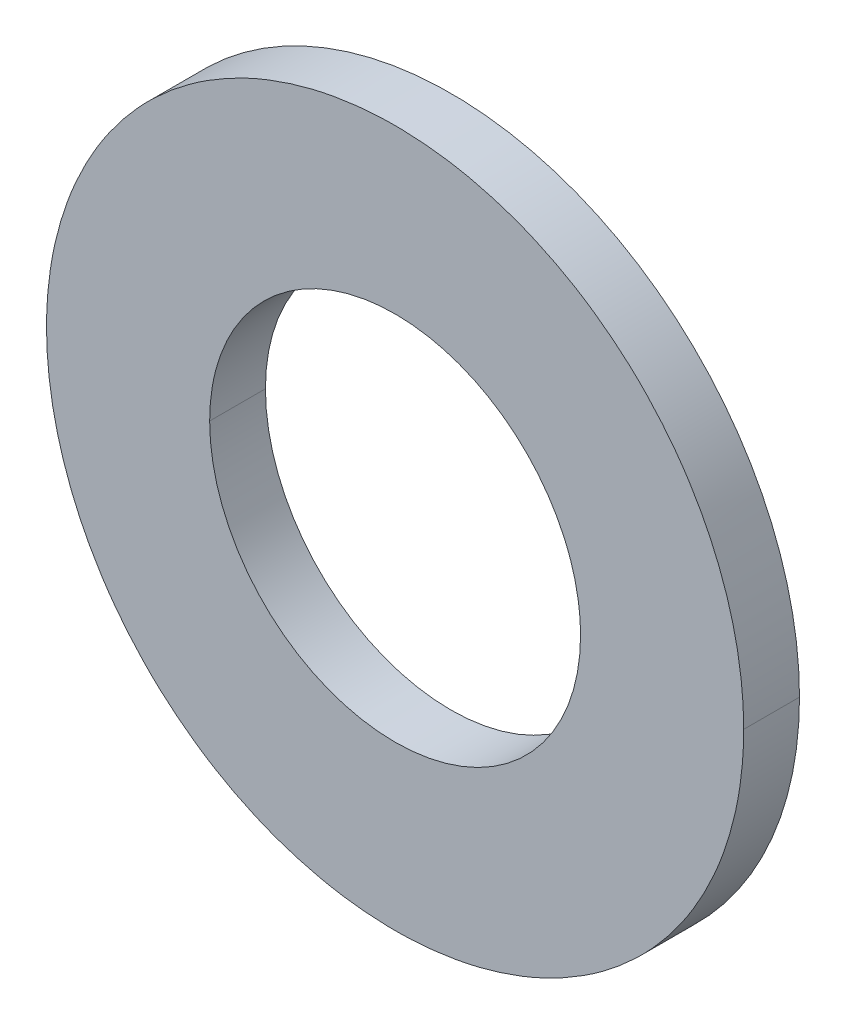
ISO-10303-21;
HEADER;
FILE_DESCRIPTION(('STEP AP214'),'2;1');
FILE_NAME('part.step','',(''),(''),'','','');
FILE_SCHEMA(('AUTOMOTIVE_DESIGN { 1 0 10303 214 1 1 1 1 }'));
ENDSEC;
DATA;
#1=APPLICATION_CONTEXT('core data for automotive mechanical design processes');
#2=APPLICATION_PROTOCOL_DEFINITION('international standard','automotive_design',2000,#1);
#3=PRODUCT_CONTEXT('',#1,'mechanical');
#4=PRODUCT('Part','Part','',(#3));
#5=PRODUCT_RELATED_PRODUCT_CATEGORY('part','',(#4));
#6=PRODUCT_DEFINITION_FORMATION('','',#4);
#7=PRODUCT_DEFINITION_CONTEXT('part definition',#1,'design');
#8=PRODUCT_DEFINITION('design','',#6,#7);
#9=PRODUCT_DEFINITION_SHAPE('','',#8);
#10=(LENGTH_UNIT() NAMED_UNIT(*) SI_UNIT(.MILLI.,.METRE.));
#11=(NAMED_UNIT(*) PLANE_ANGLE_UNIT() SI_UNIT($,.RADIAN.));
#12=(NAMED_UNIT(*) SI_UNIT($,.STERADIAN.) SOLID_ANGLE_UNIT());
#13=UNCERTAINTY_MEASURE_WITH_UNIT(LENGTH_MEASURE(1.E-05),#10,'distance_accuracy_value','');
#14=(GEOMETRIC_REPRESENTATION_CONTEXT(3) GLOBAL_UNCERTAINTY_ASSIGNED_CONTEXT((#13)) GLOBAL_UNIT_ASSIGNED_CONTEXT((#10,
#11,#12)) REPRESENTATION_CONTEXT('',''));
#15=CARTESIAN_POINT('',(0.,0.,0.));
#16=DIRECTION('',(0.,0.,1.));
#17=DIRECTION('',(1.,0.,0.));
#18=AXIS2_PLACEMENT_3D('',#15,#16,#17);
#19=CARTESIAN_POINT('',(6.35,0.,-1.016));
#20=CARTESIAN_POINT('',(6.35,0.,0.));
#21=(BOUNDED_CURVE() B_SPLINE_CURVE(1,(#19,#20),.UNSPECIFIED.,.F.,
.F.) B_SPLINE_CURVE_WITH_KNOTS((2,2),(0.,1.),
.UNSPECIFIED.) CURVE() GEOMETRIC_REPRESENTATION_ITEM() RATIONAL_B_SPLINE_CURVE((1.,1.)) REPRESENTATION_ITEM(''));
#22=CARTESIAN_POINT('',(0.,0.,-1.016));
#23=DIRECTION('',(0.,0.,1.));
#24=AXIS1_PLACEMENT('',#22,#23);
#25=SURFACE_OF_REVOLUTION('',#21,#24);
#26=CARTESIAN_POINT('',(-6.35,-2.60481354214471E-09,-1.016));
#27=CARTESIAN_POINT('',(-6.35,-2.60481354214471E-09,-0.973666666666667));
#28=CARTESIAN_POINT('',(-6.35,-2.60481354214471E-09,-0.931333333333333));
#29=CARTESIAN_POINT('',(-6.35,-2.60481354214471E-09,-0.846666666666667));
#30=CARTESIAN_POINT('',(-6.35,-2.60481354214471E-09,-0.804333333333333));
#31=CARTESIAN_POINT('',(-6.35,-2.60481354214471E-09,-0.719666666666667));
#32=CARTESIAN_POINT('',(-6.35,-2.60481354214471E-09,-0.677333333333333));
#33=CARTESIAN_POINT('',(-6.35,-2.60481354214471E-09,-0.592666666666667));
#34=CARTESIAN_POINT('',(-6.35,-2.60481354214471E-09,-0.550333333333333));
#35=CARTESIAN_POINT('',(-6.35,-2.60481354214471E-09,-0.465666666666667));
#36=CARTESIAN_POINT('',(-6.35,-2.60481354214471E-09,-0.423333333333333));
#37=CARTESIAN_POINT('',(-6.35,-2.60481354214471E-09,-0.338666666666667));
#38=CARTESIAN_POINT('',(-6.35,-2.60481354214471E-09,-0.296333333333333));
#39=CARTESIAN_POINT('',(-6.35,-2.60481354214471E-09,-0.211666666666667));
#40=CARTESIAN_POINT('',(-6.35,-2.60481354214471E-09,-0.169333333333333));
#41=CARTESIAN_POINT('',(-6.35,-2.60481354214471E-09,-0.0846666666666666));
#42=CARTESIAN_POINT('',(-6.35,-2.60481354214471E-09,-0.0423333333333333));
#43=CARTESIAN_POINT('',(-6.35,-2.60481354214471E-09,0.));
#44=B_SPLINE_CURVE_WITH_KNOTS('',3,(#26,#27,#28,#29,#30,#31,#32,#33,#34,#35,#36,#37,#38,#39,#40,
#41,#42,#43),.UNSPECIFIED.,.F.,.F.,(4,2,2,2,2,2,2,2,4),(0.,0.127,0.254,0.381,0.508,0.635,0.762,
0.889,1.016),.UNSPECIFIED.);
#45=CARTESIAN_POINT('',(-6.34999999895013,-1.7365423614298E-09,-1.016));
#46=VERTEX_POINT('',#45);
#47=CARTESIAN_POINT('',(-6.34999999895013,-1.7365423614298E-09,0.));
#48=VERTEX_POINT('',#47);
#49=EDGE_CURVE('E74',#46,#48,#44,.T.);
#50=ORIENTED_EDGE('',*,*,#49,.T.);
#51=CARTESIAN_POINT('',(6.3499999968504,0.,0.));
#52=CARTESIAN_POINT('',(6.3500088071393,0.10402718293358,0.));
#53=CARTESIAN_POINT('',(6.34746861410088,0.208055834112407,0.));
#54=CARTESIAN_POINT('',(6.33729199938339,0.415611505818262,0.));
#55=CARTESIAN_POINT('',(6.32966789939476,0.519139131064897,0.));
#56=CARTESIAN_POINT('',(6.30932536308378,0.725693057743752,0.));
#57=CARTESIAN_POINT('',(6.29660692678814,0.8287193591786,0.));
#58=CARTESIAN_POINT('',(6.2660910307563,1.03427093334799,0.));
#59=CARTESIAN_POINT('',(6.24828135058346,1.13679438949575,0.));
#60=CARTESIAN_POINT('',(6.2076917179511,1.34085269992039,0.));
#61=CARTESIAN_POINT('',(6.18491176547595,1.44238755419415,0.));
#62=CARTESIAN_POINT('',(6.13444327093591,1.64397021747285,0.));
#63=CARTESIAN_POINT('',(6.10676671542323,1.74402102540889,0.));
#64=CARTESIAN_POINT('',(6.04651712870232,1.94263731641986,0.));
#65=CARTESIAN_POINT('',(6.01394409748051,2.04120279949067,0.));
#66=CARTESIAN_POINT('',(5.94391376914439,2.23685143757296,0.));
#67=CARTESIAN_POINT('',(5.9064448393609,2.33393042665802,0.));
#68=CARTESIAN_POINT('',(5.82682523300257,2.5261491630898,0.));
#69=CARTESIAN_POINT('',(5.78467455639334,2.62128891042227,0.));
#70=CARTESIAN_POINT('',(5.69584899617699,2.8091523093258,0.));
#71=CARTESIAN_POINT('',(5.64918528387286,2.90188124068928,0.));
#72=CARTESIAN_POINT('',(5.55134525169993,3.08492706417087,0.));
#73=CARTESIAN_POINT('',(5.50016893184294,3.17524395629528,0.));
#74=CARTESIAN_POINT('',(5.39331505899756,3.35347101977729,0.));
#75=CARTESIAN_POINT('',(5.33762690959841,3.44137483584233,0.));
#76=CARTESIAN_POINT('',(5.22203715653275,3.61436712646551,0.));
#77=CARTESIAN_POINT('',(5.16213555291289,3.69945560105484,0.));
#78=CARTESIAN_POINT('',(5.03836642484516,3.86638024965866,0.));
#79=CARTESIAN_POINT('',(4.97450882698995,3.94822378141291,0.));
#80=CARTESIAN_POINT('',(4.8428382975015,4.10866478685413,0.));
#81=CARTESIAN_POINT('',(4.77502536585405,4.18726226052944,0.));
#82=CARTESIAN_POINT('',(4.63545428721804,4.34121858553975,0.));
#83=CARTESIAN_POINT('',(4.56368698725877,4.41656913641962,0.));
#84=CARTESIAN_POINT('',(4.41656913641962,4.56368698725878,0.));
#85=CARTESIAN_POINT('',(4.34121858553975,4.63545428721807,0.));
#86=CARTESIAN_POINT('',(4.18726226052943,4.77502536585404,0.));
#87=CARTESIAN_POINT('',(4.10866478685413,4.84283829750142,0.));
#88=CARTESIAN_POINT('',(3.94822378141289,4.97450882699004,0.));
#89=CARTESIAN_POINT('',(3.86638024965861,5.03836642484548,0.));
#90=CARTESIAN_POINT('',(3.69945560105486,5.16213555291257,0.));
#91=CARTESIAN_POINT('',(3.61436712646562,5.22203715653154,0.));
#92=CARTESIAN_POINT('',(3.44137483584221,5.33762690959962,0.));
#93=CARTESIAN_POINT('',(3.35347101977685,5.39331505900206,0.));
#94=CARTESIAN_POINT('',(3.1752439562957,5.50016893183845,0.));
#95=CARTESIAN_POINT('',(3.08492706417247,5.55134525168318,0.));
#96=CARTESIAN_POINT('',(2.90188124068766,5.64918528388961,0.));
#97=CARTESIAN_POINT('',(2.80915230931978,5.6958489962395,0.));
#98=CARTESIAN_POINT('',(2.62128891042829,5.78467455633069,0.));
#99=CARTESIAN_POINT('',(2.52614916311232,5.82682523276847,0.));
#100=CARTESIAN_POINT('',(2.3339304266355,5.906444839595,0.));
#101=CARTESIAN_POINT('',(2.2368514374889,5.94391377001815,0.));
#102=CARTESIAN_POINT('',(2.04120279957451,6.01394409660886,0.));
#103=CARTESIAN_POINT('',(1.94263731673244,6.04651712545292,0.));
#104=CARTESIAN_POINT('',(1.74402102509629,6.10676671867264,0.));
#105=CARTESIAN_POINT('',(1.64397021630633,6.13444328306189,0.));
#106=CARTESIAN_POINT('',(1.44238755536348,6.18491175332063,0.));
#107=CARTESIAN_POINT('',(1.34085270428929,6.2076916725361,0.));
#108=CARTESIAN_POINT('',(1.13679438512685,6.24828139599846,0.));
#109=CARTESIAN_POINT('',(1.03427091704172,6.26609120026098,0.));
#110=CARTESIAN_POINT('',(0.828719375445476,6.2966067576928,0.));
#111=CARTESIAN_POINT('',(0.725693118384898,6.30932473271503,0.));
#112=CARTESIAN_POINT('',(0.519139070423723,6.32966852976351,0.));
#113=CARTESIAN_POINT('',(0.415611279520495,6.33729435176305,0.));
#114=CARTESIAN_POINT('',(0.208056060957957,6.34746625602671,0.));
#115=CARTESIAN_POINT('',(0.104028030478978,6.3499999968504,0.));
#116=CARTESIAN_POINT('',(-0.104028030478988,6.3499999968504,0.));
#117=CARTESIAN_POINT('',(-0.208056060957976,6.34746625602671,0.));
#118=CARTESIAN_POINT('',(-0.415611279520522,6.33729435176305,0.));
#119=CARTESIAN_POINT('',(-0.519139070423747,6.32966852976351,0.));
#120=CARTESIAN_POINT('',(-0.725693118384917,6.30932473271503,0.));
#121=CARTESIAN_POINT('',(-0.828719375445492,6.2966067576928,0.));
#122=CARTESIAN_POINT('',(-1.03427091704173,6.26609120026098,0.));
#123=CARTESIAN_POINT('',(-1.13679438512685,6.24828139599846,0.));
#124=CARTESIAN_POINT('',(-1.34085270428929,6.2076916725361,0.));
#125=CARTESIAN_POINT('',(-1.44238755536349,6.18491175332062,0.));
#126=CARTESIAN_POINT('',(-1.64397021630634,6.13444328306188,0.));
#127=CARTESIAN_POINT('',(-1.7440210250963,6.10676671867263,0.));
#128=CARTESIAN_POINT('',(-1.94263731673246,6.04651712545292,0.));
#129=CARTESIAN_POINT('',(-2.04120279957452,6.01394409660886,0.));
#130=CARTESIAN_POINT('',(-2.23685143748891,5.94391377001815,0.));
#131=CARTESIAN_POINT('',(-2.3339304266355,5.906444839595,0.));
#132=CARTESIAN_POINT('',(-2.52614916311233,5.82682523276847,0.));
#133=CARTESIAN_POINT('',(-2.6212889104283,5.78467455633068,0.));
#134=CARTESIAN_POINT('',(-2.80915230931979,5.69584899623949,0.));
#135=CARTESIAN_POINT('',(-2.90188124068767,5.64918528388961,0.));
#136=CARTESIAN_POINT('',(-3.08492706417248,5.55134525168318,0.));
#137=CARTESIAN_POINT('',(-3.17524395629571,5.50016893183845,0.));
#138=CARTESIAN_POINT('',(-3.35347101977686,5.39331505900206,0.));
#139=CARTESIAN_POINT('',(-3.44137483584221,5.33762690959962,0.));
#140=CARTESIAN_POINT('',(-3.61436712646562,5.22203715653154,0.));
#141=CARTESIAN_POINT('',(-3.69945560105486,5.16213555291257,0.));
#142=CARTESIAN_POINT('',(-3.86638024965862,5.03836642484548,0.));
#143=CARTESIAN_POINT('',(-3.9482237814129,4.97450882699003,0.));
#144=CARTESIAN_POINT('',(-4.10866478685414,4.84283829750141,0.));
#145=CARTESIAN_POINT('',(-4.18726226052944,4.77502536585403,0.));
#146=CARTESIAN_POINT('',(-4.34121858553975,4.63545428721806,0.));
#147=CARTESIAN_POINT('',(-4.41656913641963,4.56368698725878,0.));
#148=CARTESIAN_POINT('',(-4.56368698725878,4.41656913641962,0.));
#149=CARTESIAN_POINT('',(-4.63545428721805,4.34121858553974,0.));
#150=CARTESIAN_POINT('',(-4.77502536585407,4.18726226052942,0.));
#151=CARTESIAN_POINT('',(-4.84283829750152,4.10866478685412,0.));
#152=CARTESIAN_POINT('',(-4.97450882698996,3.94822378141289,0.));
#153=CARTESIAN_POINT('',(-5.03836642484517,3.86638024965863,0.));
#154=CARTESIAN_POINT('',(-5.1621355529129,3.69945560105482,0.));
#155=CARTESIAN_POINT('',(-5.22203715653275,3.6143671264655,0.));
#156=CARTESIAN_POINT('',(-5.33762690959841,3.44137483584232,0.));
#157=CARTESIAN_POINT('',(-5.39331505899757,3.35347101977728,0.));
#158=CARTESIAN_POINT('',(-5.50016893184295,3.17524395629526,0.));
#159=CARTESIAN_POINT('',(-5.55134525169994,3.08492706417085,0.));
#160=CARTESIAN_POINT('',(-5.64918528387286,2.90188124068927,0.));
#161=CARTESIAN_POINT('',(-5.69584899617699,2.80915230932579,0.));
#162=CARTESIAN_POINT('',(-5.78467455639334,2.62128891042226,0.));
#163=CARTESIAN_POINT('',(-5.82682523300257,2.5261491630898,0.));
#164=CARTESIAN_POINT('',(-5.9064448393609,2.33393042665802,0.));
#165=CARTESIAN_POINT('',(-5.9439137691444,2.23685143757296,0.));
#166=CARTESIAN_POINT('',(-6.01394409748051,2.04120279949065,0.));
#167=CARTESIAN_POINT('',(-6.04651712870233,1.94263731641985,0.));
#168=CARTESIAN_POINT('',(-6.10676671542323,1.74402102540888,0.));
#169=CARTESIAN_POINT('',(-6.13444327093592,1.64397021747284,0.));
#170=CARTESIAN_POINT('',(-6.18491176547595,1.44238755419414,0.));
#171=CARTESIAN_POINT('',(-6.2076917179511,1.34085269992038,0.));
#172=CARTESIAN_POINT('',(-6.24828135058346,1.13679438949575,0.));
#173=CARTESIAN_POINT('',(-6.26609103075631,1.03427093334798,0.));
#174=CARTESIAN_POINT('',(-6.29660692678814,0.828719359178586,0.));
#175=CARTESIAN_POINT('',(-6.30932536308378,0.725693057743739,0.));
#176=CARTESIAN_POINT('',(-6.32966789939476,0.519139131064887,0.));
#177=CARTESIAN_POINT('',(-6.33729199938339,0.415611505818254,0.));
#178=CARTESIAN_POINT('',(-6.34746861410088,0.208055834112402,0.));
#179=CARTESIAN_POINT('',(-6.3500088071393,0.104027182933578,0.));
#180=CARTESIAN_POINT('',(-6.3499999968504,0.,0.));
#181=B_SPLINE_CURVE_WITH_KNOTS('',3,(#51,#52,#53,#54,#55,#56,#57,#58,#59,#60,#61,#62,#63,#64,
#65,#66,#67,#68,#69,#70,#71,#72,#73,#74,#75,#76,#77,#78,#79,#80,#81,#82,#83,#84,#85,#86,#87,#88,
#89,#90,#91,#92,#93,#94,#95,#96,#97,#98,#99,#100,#101,#102,#103,#104,#105,#106,#107,#108,#109,
#110,#111,#112,#113,#114,#115,#116,#117,#118,#119,#120,#121,#122,#123,#124,#125,#126,#127,#128,
#129,#130,#131,#132,#133,#134,#135,#136,#137,#138,#139,#140,#141,#142,#143,#144,#145,#146,#147,
#148,#149,#150,#151,#152,#153,#154,#155,#156,#157,#158,#159,#160,#161,#162,#163,#164,#165,#166,
#167,#168,#169,#170,#171,#172,#173,#174,#175,#176,#177,#178,#179,#180),.UNSPECIFIED.,.F.,.F.,(4,
2,2,2,2,2,2,2,2,2,2,2,2,2,2,2,2,2,2,2,2,2,2,2,2,2,2,2,2,2,2,2,2,2,2,2,2,2,2,2,2,2,2,2,2,2,2,2,2,
2,2,2,2,2,2,2,2,2,2,2,2,2,2,2,4),(0.,0.312052320870975,0.6233510669502,0.934649811397064,
1.24670212738279,1.5587544443501,1.87005318913704,2.18135193478836,2.49340425434254,
2.80545657618973,3.11675532396463,3.42805407092507,3.74010639033474,4.05215870628908,
4.36345745005634,4.67475619494211,4.98680851424385,5.2988608335456,5.61015957843137,
5.92145832219863,6.23351063815297,6.54556295756265,6.85686170452308,7.16816045229799,
7.48021277414516,7.79226509369936,8.10356383935067,8.41486258413761,8.72691490110491,
9.03896721709065,9.35026596153752,9.66156470761674,9.9736170284877,10.2856693493587,
10.5969680954379,10.9082668398848,11.2203191558705,11.5323714728378,11.8436702176247,
12.1549689632761,12.4670212828302,12.7790736046774,13.0903723524523,13.4016710994128,
13.7137234188224,14.0257757347768,14.337074478544,14.6483732234298,14.9604255427316,
15.2724778620333,15.5837766069191,15.8950753506863,16.2071276666407,16.5191799860504,
16.8304787330108,17.1417774807857,17.4538298026329,17.7658821221871,18.0771808678384,
18.3884796126253,18.7005319295926,19.0125842455784,19.3238829900252,19.6351817361044,
19.9472340569754),.UNSPECIFIED.);
#182=CARTESIAN_POINT('',(6.34999999895013,-3.80124480370648E-10,0.));
#183=VERTEX_POINT('',#182);
#184=EDGE_CURVE('E80',#183,#48,#181,.T.);
#185=ORIENTED_EDGE('',*,*,#184,.F.);
#186=CARTESIAN_POINT('',(6.35,0.,0.));
#187=CARTESIAN_POINT('',(6.35,0.,-0.0423333333333333));
#188=CARTESIAN_POINT('',(6.35,0.,-0.0846666666666667));
#189=CARTESIAN_POINT('',(6.35,0.,-0.169333333333333));
#190=CARTESIAN_POINT('',(6.35,0.,-0.211666666666667));
#191=CARTESIAN_POINT('',(6.35,0.,-0.296333333333333));
#192=CARTESIAN_POINT('',(6.35,0.,-0.338666666666667));
#193=CARTESIAN_POINT('',(6.35,0.,-0.423333333333333));
#194=CARTESIAN_POINT('',(6.35,0.,-0.465666666666667));
#195=CARTESIAN_POINT('',(6.35,0.,-0.550333333333333));
#196=CARTESIAN_POINT('',(6.35,0.,-0.592666666666667));
#197=CARTESIAN_POINT('',(6.35,0.,-0.677333333333333));
#198=CARTESIAN_POINT('',(6.35,0.,-0.719666666666667));
#199=CARTESIAN_POINT('',(6.35,0.,-0.804333333333333));
#200=CARTESIAN_POINT('',(6.35,0.,-0.846666666666667));
#201=CARTESIAN_POINT('',(6.35,0.,-0.931333333333333));
#202=CARTESIAN_POINT('',(6.35,0.,-0.973666666666667));
#203=CARTESIAN_POINT('',(6.35,0.,-1.016));
#204=B_SPLINE_CURVE_WITH_KNOTS('',3,(#186,#187,#188,#189,#190,#191,#192,#193,#194,#195,#196,
#197,#198,#199,#200,#201,#202,#203),.UNSPECIFIED.,.F.,.F.,(4,2,2,2,2,2,2,2,4),(0.,0.127,0.254,
0.381,0.508,0.635,0.762,0.889,1.016),.UNSPECIFIED.);
#205=CARTESIAN_POINT('',(6.34999999895013,-3.80124480370648E-10,-1.016));
#206=VERTEX_POINT('',#205);
#207=EDGE_CURVE('E59',#183,#206,#204,.T.);
#208=ORIENTED_EDGE('',*,*,#207,.T.);
#209=CARTESIAN_POINT('',(0.,0.,-1.016));
#210=DIRECTION('',(0.,0.,1.));
#211=DIRECTION('',(1.,0.,0.));
#212=AXIS2_PLACEMENT_3D('',#209,#210,#211);
#213=CIRCLE('',#212,6.35);
#214=EDGE_CURVE('E110',#206,#46,#213,.T.);
#215=ORIENTED_EDGE('',*,*,#214,.T.);
#216=EDGE_LOOP('',(#50,#185,#208,#215));
#217=FACE_BOUND('',#216,.T.);
#218=ADVANCED_FACE('F16',(#217),#25,.T.);
#219=CARTESIAN_POINT('',(6.35,0.,-1.016));
#220=CARTESIAN_POINT('',(6.35,0.,0.));
#221=(BOUNDED_CURVE() B_SPLINE_CURVE(1,(#219,#220),.UNSPECIFIED.,.F.,
.F.) B_SPLINE_CURVE_WITH_KNOTS((2,2),(0.,1.),
.UNSPECIFIED.) CURVE() GEOMETRIC_REPRESENTATION_ITEM() RATIONAL_B_SPLINE_CURVE((1.,1.)) REPRESENTATION_ITEM(''));
#222=CARTESIAN_POINT('',(0.,0.,-1.016));
#223=DIRECTION('',(0.,0.,1.));
#224=AXIS1_PLACEMENT('',#222,#223);
#225=SURFACE_OF_REVOLUTION('',#221,#224);
#226=CARTESIAN_POINT('',(0.,0.,-1.016));
#227=DIRECTION('',(0.,0.,1.));
#228=DIRECTION('',(-1.,-4.10206857030662E-10,0.));
#229=AXIS2_PLACEMENT_3D('',#226,#227,#228);
#230=CIRCLE('',#229,6.35);
#231=EDGE_CURVE('E71',#46,#206,#230,.T.);
#232=ORIENTED_EDGE('',*,*,#231,.T.);
#233=ORIENTED_EDGE('',*,*,#207,.F.);
#234=CARTESIAN_POINT('',(-6.3499999968504,0.,0.));
#235=CARTESIAN_POINT('',(-6.3500088071393,-0.104027182933581,0.));
#236=CARTESIAN_POINT('',(-6.34746861410088,-0.208055834112408,0.));
#237=CARTESIAN_POINT('',(-6.33729199938339,-0.415611505818266,0.));
#238=CARTESIAN_POINT('',(-6.32966789939476,-0.519139131064903,0.));
#239=CARTESIAN_POINT('',(-6.30932536308377,-0.72569305774376,0.));
#240=CARTESIAN_POINT('',(-6.29660692678814,-0.82871935917861,0.));
#241=CARTESIAN_POINT('',(-6.2660910307563,-1.034270933348,0.));
#242=CARTESIAN_POINT('',(-6.24828135058346,-1.13679438949576,0.));
#243=CARTESIAN_POINT('',(-6.2076917179511,-1.34085269992039,0.));
#244=CARTESIAN_POINT('',(-6.18491176547595,-1.44238755419415,0.));
#245=CARTESIAN_POINT('',(-6.13444327093591,-1.64397021747286,0.));
#246=CARTESIAN_POINT('',(-6.10676671542323,-1.7440210254089,0.));
#247=CARTESIAN_POINT('',(-6.04651712870232,-1.94263731641986,0.));
#248=CARTESIAN_POINT('',(-6.01394409748051,-2.04120279949067,0.));
#249=CARTESIAN_POINT('',(-5.94391376914439,-2.23685143757297,0.));
#250=CARTESIAN_POINT('',(-5.9064448393609,-2.33393042665802,0.));
#251=CARTESIAN_POINT('',(-5.82682523300257,-2.5261491630898,0.));
#252=CARTESIAN_POINT('',(-5.78467455639334,-2.62128891042227,0.));
#253=CARTESIAN_POINT('',(-5.69584899617699,-2.8091523093258,0.));
#254=CARTESIAN_POINT('',(-5.64918528387286,-2.90188124068928,0.));
#255=CARTESIAN_POINT('',(-5.55134525169993,-3.08492706417087,0.));
#256=CARTESIAN_POINT('',(-5.50016893184294,-3.17524395629528,0.));
#257=CARTESIAN_POINT('',(-5.39331505899756,-3.3534710197773,0.));
#258=CARTESIAN_POINT('',(-5.33762690959841,-3.44137483584233,0.));
#259=CARTESIAN_POINT('',(-5.22203715653275,-3.61436712646551,0.));
#260=CARTESIAN_POINT('',(-5.16213555291289,-3.69945560105484,0.));
#261=CARTESIAN_POINT('',(-5.03836642484515,-3.86638024965866,0.));
#262=CARTESIAN_POINT('',(-4.97450882698994,-3.94822378141292,0.));
#263=CARTESIAN_POINT('',(-4.84283829750149,-4.10866478685414,0.));
#264=CARTESIAN_POINT('',(-4.77502536585404,-4.18726226052945,0.));
#265=CARTESIAN_POINT('',(-4.63545428721803,-4.34121858553976,0.));
#266=CARTESIAN_POINT('',(-4.56368698725877,-4.41656913641963,0.));
#267=CARTESIAN_POINT('',(-4.41656913641962,-4.56368698725878,0.));
#268=CARTESIAN_POINT('',(-4.34121858553974,-4.63545428721808,0.));
#269=CARTESIAN_POINT('',(-4.18726226052942,-4.77502536585405,0.));
#270=CARTESIAN_POINT('',(-4.10866478685412,-4.84283829750143,0.));
#271=CARTESIAN_POINT('',(-3.94822378141288,-4.97450882699005,0.));
#272=CARTESIAN_POINT('',(-3.86638024965861,-5.03836642484549,0.));
#273=CARTESIAN_POINT('',(-3.69945560105486,-5.16213555291257,0.));
#274=CARTESIAN_POINT('',(-3.61436712646562,-5.22203715653154,0.));
#275=CARTESIAN_POINT('',(-3.44137483584221,-5.33762690959962,0.));
#276=CARTESIAN_POINT('',(-3.35347101977685,-5.39331505900207,0.));
#277=CARTESIAN_POINT('',(-3.1752439562957,-5.50016893183846,0.));
#278=CARTESIAN_POINT('',(-3.08492706417246,-5.55134525168319,0.));
#279=CARTESIAN_POINT('',(-2.90188124068765,-5.64918528388962,0.));
#280=CARTESIAN_POINT('',(-2.80915230931977,-5.6958489962395,0.));
#281=CARTESIAN_POINT('',(-2.62128891042829,-5.78467455633069,0.));
#282=CARTESIAN_POINT('',(-2.52614916311232,-5.82682523276847,0.));
#283=CARTESIAN_POINT('',(-2.3339304266355,-5.90644483959501,0.));
#284=CARTESIAN_POINT('',(-2.2368514374889,-5.94391377001816,0.));
#285=CARTESIAN_POINT('',(-2.0412027995745,-6.01394409660887,0.));
#286=CARTESIAN_POINT('',(-1.94263731673244,-6.04651712545292,0.));
#287=CARTESIAN_POINT('',(-1.74402102509629,-6.10676671867264,0.));
#288=CARTESIAN_POINT('',(-1.64397021630633,-6.13444328306189,0.));
#289=CARTESIAN_POINT('',(-1.44238755536348,-6.18491175332063,0.));
#290=CARTESIAN_POINT('',(-1.34085270428929,-6.2076916725361,0.));
#291=CARTESIAN_POINT('',(-1.13679438512685,-6.24828139599846,0.));
#292=CARTESIAN_POINT('',(-1.03427091704172,-6.26609120026098,0.));
#293=CARTESIAN_POINT('',(-0.828719375445477,-6.2966067576928,0.));
#294=CARTESIAN_POINT('',(-0.725693118384899,-6.30932473271503,0.));
#295=CARTESIAN_POINT('',(-0.519139070423722,-6.32966852976351,0.));
#296=CARTESIAN_POINT('',(-0.415611279520492,-6.33729435176305,0.));
#297=CARTESIAN_POINT('',(-0.208056060957953,-6.34746625602671,0.));
#298=CARTESIAN_POINT('',(-0.104028030478977,-6.3499999968504,0.));
#299=CARTESIAN_POINT('',(0.104028030478991,-6.3499999968504,0.));
#300=CARTESIAN_POINT('',(0.208056060957982,-6.34746625602671,0.));
#301=CARTESIAN_POINT('',(0.415611279520533,-6.33729435176305,0.));
#302=CARTESIAN_POINT('',(0.51913907042376,-6.32966852976351,0.));
#303=CARTESIAN_POINT('',(0.725693118384935,-6.30932473271503,0.));
#304=CARTESIAN_POINT('',(0.828719375445513,-6.2966067576928,0.));
#305=CARTESIAN_POINT('',(1.03427091704174,-6.26609120026098,0.));
#306=CARTESIAN_POINT('',(1.13679438512686,-6.24828139599846,0.));
#307=CARTESIAN_POINT('',(1.3408527042893,-6.2076916725361,0.));
#308=CARTESIAN_POINT('',(1.44238755536351,-6.18491175332062,0.));
#309=CARTESIAN_POINT('',(1.64397021630637,-6.13444328306188,0.));
#310=CARTESIAN_POINT('',(1.74402102509633,-6.10676671867262,0.));
#311=CARTESIAN_POINT('',(1.94263731673249,-6.04651712545291,0.));
#312=CARTESIAN_POINT('',(2.04120279957456,-6.01394409660885,0.));
#313=CARTESIAN_POINT('',(2.23685143748893,-5.94391377001814,0.));
#314=CARTESIAN_POINT('',(2.33393042663551,-5.906444839595,0.));
#315=CARTESIAN_POINT('',(2.52614916311233,-5.82682523276847,0.));
#316=CARTESIAN_POINT('',(2.62128891042832,-5.78467455633067,0.));
#317=CARTESIAN_POINT('',(2.80915230931981,-5.69584899623948,0.));
#318=CARTESIAN_POINT('',(2.90188124068769,-5.6491852838896,0.));
#319=CARTESIAN_POINT('',(3.08492706417249,-5.55134525168318,0.));
#320=CARTESIAN_POINT('',(3.17524395629572,-5.50016893183845,0.));
#321=CARTESIAN_POINT('',(3.35347101977686,-5.39331505900206,0.));
#322=CARTESIAN_POINT('',(3.44137483584221,-5.33762690959962,0.));
#323=CARTESIAN_POINT('',(3.61436712646562,-5.22203715653154,0.));
#324=CARTESIAN_POINT('',(3.69945560105486,-5.16213555291257,0.));
#325=CARTESIAN_POINT('',(3.86638024965862,-5.03836642484548,0.));
#326=CARTESIAN_POINT('',(3.9482237814129,-4.97450882699003,0.));
#327=CARTESIAN_POINT('',(4.10866478685414,-4.84283829750141,0.));
#328=CARTESIAN_POINT('',(4.18726226052944,-4.77502536585403,0.));
#329=CARTESIAN_POINT('',(4.34121858553975,-4.63545428721806,0.));
#330=CARTESIAN_POINT('',(4.41656913641963,-4.56368698725878,0.));
#331=CARTESIAN_POINT('',(4.56368698725878,-4.41656913641962,0.));
#332=CARTESIAN_POINT('',(4.63545428721805,-4.34121858553974,0.));
#333=CARTESIAN_POINT('',(4.77502536585407,-4.18726226052942,0.));
#334=CARTESIAN_POINT('',(4.84283829750152,-4.10866478685411,0.));
#335=CARTESIAN_POINT('',(4.97450882698996,-3.94822378141288,0.));
#336=CARTESIAN_POINT('',(5.03836642484517,-3.86638024965863,0.));
#337=CARTESIAN_POINT('',(5.1621355529129,-3.69945560105482,0.));
#338=CARTESIAN_POINT('',(5.22203715653275,-3.6143671264655,0.));
#339=CARTESIAN_POINT('',(5.33762690959841,-3.44137483584232,0.));
#340=CARTESIAN_POINT('',(5.39331505899757,-3.35347101977728,0.));
#341=CARTESIAN_POINT('',(5.50016893184296,-3.17524395629525,0.));
#342=CARTESIAN_POINT('',(5.55134525169995,-3.08492706417084,0.));
#343=CARTESIAN_POINT('',(5.64918528387287,-2.90188124068925,0.));
#344=CARTESIAN_POINT('',(5.695848996177,-2.80915230932577,0.));
#345=CARTESIAN_POINT('',(5.78467455639335,-2.62128891042225,0.));
#346=CARTESIAN_POINT('',(5.82682523300258,-2.52614916308979,0.));
#347=CARTESIAN_POINT('',(5.90644483936091,-2.33393042665801,0.));
#348=CARTESIAN_POINT('',(5.94391376914441,-2.23685143757293,0.));
#349=CARTESIAN_POINT('',(6.01394409748052,-2.04120279949062,0.));
#350=CARTESIAN_POINT('',(6.04651712870234,-1.94263731641981,0.));
#351=CARTESIAN_POINT('',(6.10676671542324,-1.74402102540884,0.));
#352=CARTESIAN_POINT('',(6.13444327093593,-1.6439702174728,0.));
#353=CARTESIAN_POINT('',(6.18491176547596,-1.44238755419411,0.));
#354=CARTESIAN_POINT('',(6.2076917179511,-1.34085269992037,0.));
#355=CARTESIAN_POINT('',(6.24828135058346,-1.13679438949574,0.));
#356=CARTESIAN_POINT('',(6.26609103075631,-1.03427093334796,0.));
#357=CARTESIAN_POINT('',(6.29660692678815,-0.828719359178564,0.));
#358=CARTESIAN_POINT('',(6.30932536308378,-0.72569305774372,0.));
#359=CARTESIAN_POINT('',(6.32966789939476,-0.519139131064874,0.));
#360=CARTESIAN_POINT('',(6.33729199938339,-0.415611505818242,0.));
#361=CARTESIAN_POINT('',(6.34746861410088,-0.208055834112395,0.));
#362=CARTESIAN_POINT('',(6.3500088071393,-0.104027182933575,0.));
#363=CARTESIAN_POINT('',(6.3499999968504,0.,0.));
#364=B_SPLINE_CURVE_WITH_KNOTS('',3,(#234,#235,#236,#237,#238,#239,#240,#241,#242,#243,#244,
#245,#246,#247,#248,#249,#250,#251,#252,#253,#254,#255,#256,#257,#258,#259,#260,#261,#262,#263,
#264,#265,#266,#267,#268,#269,#270,#271,#272,#273,#274,#275,#276,#277,#278,#279,#280,#281,#282,
#283,#284,#285,#286,#287,#288,#289,#290,#291,#292,#293,#294,#295,#296,#297,#298,#299,#300,#301,
#302,#303,#304,#305,#306,#307,#308,#309,#310,#311,#312,#313,#314,#315,#316,#317,#318,#319,#320,
#321,#322,#323,#324,#325,#326,#327,#328,#329,#330,#331,#332,#333,#334,#335,#336,#337,#338,#339,
#340,#341,#342,#343,#344,#345,#346,#347,#348,#349,#350,#351,#352,#353,#354,#355,#356,#357,#358,
#359,#360,#361,#362,#363),.UNSPECIFIED.,.F.,.F.,(4,2,2,2,2,2,2,2,2,2,2,2,2,2,2,2,2,2,2,2,2,2,2,
2,2,2,2,2,2,2,2,2,2,2,2,2,2,2,2,2,2,2,2,2,2,2,2,2,2,2,2,2,2,2,2,2,2,2,2,2,2,2,2,2,4),(0.,
0.312052320870977,0.623351066950207,0.934649811397076,1.24670212738279,1.55875444435011,
1.87005318913705,2.18135193478836,2.49340425434254,2.80545657618973,3.11675532396464,
3.42805407092507,3.74010639033474,4.05215870628909,4.36345745005636,4.67475619494213,
4.98680851424385,5.29886083354562,5.61015957843138,5.92145832219864,6.23351063815296,
6.54556295756265,6.85686170452309,7.168160452298,7.48021277414516,7.79226509369936,
8.10356383935067,8.41486258413761,8.72691490110491,9.03896721709065,9.35026596153751,
9.66156470761675,9.9736170284877,10.2856693493587,10.5969680954379,10.9082668398848,
11.2203191558705,11.5323714728378,11.8436702176248,12.1549689632761,12.4670212828302,
12.7790736046775,13.0903723524524,13.4016710994128,13.7137234188224,14.0257757347768,
14.3370744785441,14.6483732234298,14.9604255427316,15.2724778620333,15.5837766069191,
15.8950753506864,16.2071276666407,16.5191799860504,16.8304787330108,17.1417774807857,
17.4538298026329,17.7658821221871,18.0771808678384,18.3884796126254,18.7005319295926,
19.0125842455784,19.3238829900252,19.6351817361044,19.9472340569754),.UNSPECIFIED.);
#365=EDGE_CURVE('E68',#48,#183,#364,.T.);
#366=ORIENTED_EDGE('',*,*,#365,.F.);
#367=ORIENTED_EDGE('',*,*,#49,.F.);
#368=EDGE_LOOP('',(#232,#233,#366,#367));
#369=FACE_BOUND('',#368,.T.);
#370=ADVANCED_FACE('F67',(#369),#225,.T.);
#371=CARTESIAN_POINT('',(3.3782,0.,-1.016));
#372=CARTESIAN_POINT('',(3.3782,0.,0.));
#373=(BOUNDED_CURVE() B_SPLINE_CURVE(1,(#371,#372),.UNSPECIFIED.,.F.,
.F.) B_SPLINE_CURVE_WITH_KNOTS((2,2),(0.,1.),
.UNSPECIFIED.) CURVE() GEOMETRIC_REPRESENTATION_ITEM() RATIONAL_B_SPLINE_CURVE((1.,1.)) REPRESENTATION_ITEM(''));
#374=CARTESIAN_POINT('',(0.,0.,-1.016));
#375=DIRECTION('',(0.,0.,1.));
#376=AXIS1_PLACEMENT('',#374,#375);
#377=SURFACE_OF_REVOLUTION('',#373,#376);
#378=CARTESIAN_POINT('',(3.3782,0.,-1.016));
#379=CARTESIAN_POINT('',(3.3782,0.,-0.973666666666667));
#380=CARTESIAN_POINT('',(3.3782,0.,-0.931333333333333));
#381=CARTESIAN_POINT('',(3.3782,0.,-0.846666666666667));
#382=CARTESIAN_POINT('',(3.3782,0.,-0.804333333333333));
#383=CARTESIAN_POINT('',(3.3782,0.,-0.719666666666667));
#384=CARTESIAN_POINT('',(3.3782,0.,-0.677333333333333));
#385=CARTESIAN_POINT('',(3.3782,0.,-0.592666666666667));
#386=CARTESIAN_POINT('',(3.3782,0.,-0.550333333333333));
#387=CARTESIAN_POINT('',(3.3782,0.,-0.465666666666667));
#388=CARTESIAN_POINT('',(3.3782,0.,-0.423333333333333));
#389=CARTESIAN_POINT('',(3.3782,0.,-0.338666666666667));
#390=CARTESIAN_POINT('',(3.3782,0.,-0.296333333333333));
#391=CARTESIAN_POINT('',(3.3782,0.,-0.211666666666667));
#392=CARTESIAN_POINT('',(3.3782,0.,-0.169333333333333));
#393=CARTESIAN_POINT('',(3.3782,0.,-0.0846666666666667));
#394=CARTESIAN_POINT('',(3.3782,0.,-0.0423333333333333));
#395=CARTESIAN_POINT('',(3.3782,0.,0.));
#396=B_SPLINE_CURVE_WITH_KNOTS('',3,(#378,#379,#380,#381,#382,#383,#384,#385,#386,#387,#388,
#389,#390,#391,#392,#393,#394,#395),.UNSPECIFIED.,.F.,.F.,(4,2,2,2,2,2,2,2,4),(0.,0.127,0.254,
0.381,0.508,0.635,0.762,0.889,1.016),.UNSPECIFIED.);
#397=CARTESIAN_POINT('',(3.37820000084667,-2.02226223557185E-10,-1.016));
#398=VERTEX_POINT('',#397);
#399=CARTESIAN_POINT('',(3.37820000084667,-2.02226223557185E-10,0.));
#400=VERTEX_POINT('',#399);
#401=EDGE_CURVE('E37',#398,#400,#396,.T.);
#402=ORIENTED_EDGE('',*,*,#401,.T.);
#403=CARTESIAN_POINT('',(-3.37820000254,0.,0.));
#404=CARTESIAN_POINT('',(-3.37820468959807,0.0553424614277699,0.));
#405=CARTESIAN_POINT('',(-3.37685330692379,0.110685703970527,0.));
#406=CARTESIAN_POINT('',(-3.37143934792673,0.221105321138643,0.));
#407=CARTESIAN_POINT('',(-3.36738332676336,0.276182017475821,0.));
#408=CARTESIAN_POINT('',(-3.35656109744904,0.386068705460687,0.));
#409=CARTESIAN_POINT('',(-3.34979488933225,0.440878697111736,0.));
#410=CARTESIAN_POINT('',(-3.3335604328026,0.550232132776008,0.));
#411=CARTESIAN_POINT('',(-3.32408568313716,0.60477461036802,0.));
#412=CARTESIAN_POINT('',(-3.30249199777077,0.713333631156858,0.));
#413=CARTESIAN_POINT('',(-3.2903730619648,0.767350174332792,0.));
#414=CARTESIAN_POINT('',(-3.26352382131749,0.8745921525432,0.));
#415=CARTESIAN_POINT('',(-3.2487998933285,0.927819183010756,0.));
#416=CARTESIAN_POINT('',(-3.21674711236825,1.03348305092884,0.));
#417=CARTESIAN_POINT('',(-3.19941825939893,1.08591988837996,0.));
#418=CARTESIAN_POINT('',(-3.16216212465244,1.19000496478108,0.));
#419=CARTESIAN_POINT('',(-3.1422286543068,1.24165098746243,0.));
#420=CARTESIAN_POINT('',(-3.09987102314648,1.34391135576126,0.));
#421=CARTESIAN_POINT('',(-3.07744686231164,1.39452570137039,0.));
#422=CARTESIAN_POINT('',(-3.03019166367488,1.494469029627,0.));
#423=CARTESIAN_POINT('',(-3.00536656902549,1.54380082113322,0.));
#424=CARTESIAN_POINT('',(-2.95331567275831,1.64118119879132,0.));
#425=CARTESIAN_POINT('',(-2.92608987117005,1.68922978495898,0.));
#426=CARTESIAN_POINT('',(-2.86924361361901,1.78404658229265,0.));
#427=CARTESIAN_POINT('',(-2.83961752039333,1.8308114124599,0.));
#428=CARTESIAN_POINT('',(-2.77812377199441,1.92284331011709,0.));
#429=CARTESIAN_POINT('',(-2.74625611678253,1.96811037758123,0.));
#430=CARTESIAN_POINT('',(-2.68041093829499,2.05691428986357,0.));
#431=CARTESIAN_POINT('',(-2.64643869596068,2.10045504899524,0.));
#432=CARTESIAN_POINT('',(-2.5763899737791,2.18580966435773,0.));
#433=CARTESIAN_POINT('',(-2.54031349392574,2.22762352058356,0.));
#434=CARTESIAN_POINT('',(-2.46606168133037,2.3095282874631,0.));
#435=CARTESIAN_POINT('',(-2.42788147921602,2.34961478228238,0.));
#436=CARTESIAN_POINT('',(-2.34961478228238,2.42788147921602,0.));
#437=CARTESIAN_POINT('',(-2.3095282874631,2.46606168133038,0.));
#438=CARTESIAN_POINT('',(-2.22762352058355,2.54031349392573,0.));
#439=CARTESIAN_POINT('',(-2.18580966435773,2.57638997377906,0.));
#440=CARTESIAN_POINT('',(-2.10045504899523,2.64643869596073,0.));
#441=CARTESIAN_POINT('',(-2.05691428986355,2.68041093829517,0.));
#442=CARTESIAN_POINT('',(-1.96811037758125,2.74625611678236,0.));
#443=CARTESIAN_POINT('',(-1.92284331011716,2.77812377199377,0.));
#444=CARTESIAN_POINT('',(-1.83081141245983,2.83961752039397,0.));
#445=CARTESIAN_POINT('',(-1.78404658229241,2.8692436136214,0.));
#446=CARTESIAN_POINT('',(-1.6892297849592,2.92608987116766,0.));
#447=CARTESIAN_POINT('',(-1.64118119879217,2.9533156727494,0.));
#448=CARTESIAN_POINT('',(-1.54380082113236,3.00536656903441,0.));
#449=CARTESIAN_POINT('',(-1.49446902962379,3.03019166370814,0.));
#450=CARTESIAN_POINT('',(-1.3945257013736,3.0774468622783,0.));
#451=CARTESIAN_POINT('',(-1.34391135577324,3.09987102302194,0.));
#452=CARTESIAN_POINT('',(-1.24165098745044,3.14222865443134,0.));
#453=CARTESIAN_POINT('',(-1.19000496473636,3.16216212511728,0.));
#454=CARTESIAN_POINT('',(-1.08591988842457,3.19941825893522,0.));
#455=CARTESIAN_POINT('',(-1.03348305109514,3.21674711063958,0.));
#456=CARTESIAN_POINT('',(-0.92781918284445,3.24879989505718,0.));
#457=CARTESIAN_POINT('',(-0.874592151922604,3.26352382776849,0.));
#458=CARTESIAN_POINT('',(-0.767350174954884,3.29037305549819,0.));
#459=CARTESIAN_POINT('',(-0.713333633481137,3.30249197361007,0.));
#460=CARTESIAN_POINT('',(-0.604774608043738,3.32408570729786,0.));
#461=CARTESIAN_POINT('',(-0.550232124100977,3.33356052297879,0.));
#462=CARTESIAN_POINT('',(-0.440878705765809,3.34979479937383,0.));
#463=CARTESIAN_POINT('',(-0.386068737722128,3.356560762094,0.));
#464=CARTESIAN_POINT('',(-0.276181985214366,3.36738366211841,0.));
#465=CARTESIAN_POINT('',(-0.221105200746921,3.37144059938852,0.));
#466=CARTESIAN_POINT('',(-0.110685824653675,3.37685205243253,0.));
#467=CARTESIAN_POINT('',(-0.0553429123268374,3.37820000254,0.));
#468=CARTESIAN_POINT('',(0.0553429123268422,3.37820000254,0.));
#469=CARTESIAN_POINT('',(0.110685824653684,3.37685205243252,0.));
#470=CARTESIAN_POINT('',(0.221105200746933,3.37144059938852,0.));
#471=CARTESIAN_POINT('',(0.276181985214377,3.36738366211841,0.));
#472=CARTESIAN_POINT('',(0.386068737722138,3.356560762094,0.));
#473=CARTESIAN_POINT('',(0.440878705765817,3.34979479937383,0.));
#474=CARTESIAN_POINT('',(0.550232124100983,3.33356052297879,0.));
#475=CARTESIAN_POINT('',(0.604774608043741,3.32408570729786,0.));
#476=CARTESIAN_POINT('',(0.713333633481139,3.30249197361007,0.));
#477=CARTESIAN_POINT('',(0.767350174954886,3.29037305549819,0.));
#478=CARTESIAN_POINT('',(0.87459215192261,3.26352382776849,0.));
#479=CARTESIAN_POINT('',(0.927819182844457,3.24879989505718,0.));
#480=CARTESIAN_POINT('',(1.03348305109514,3.21674711063957,0.));
#481=CARTESIAN_POINT('',(1.08591988842457,3.19941825893522,0.));
#482=CARTESIAN_POINT('',(1.19000496473637,3.16216212511728,0.));
#483=CARTESIAN_POINT('',(1.24165098745045,3.14222865443134,0.));
#484=CARTESIAN_POINT('',(1.34391135577324,3.09987102302194,0.));
#485=CARTESIAN_POINT('',(1.3945257013736,3.0774468622783,0.));
#486=CARTESIAN_POINT('',(1.4944690296238,3.03019166370813,0.));
#487=CARTESIAN_POINT('',(1.54380082113237,3.0053665690344,0.));
#488=CARTESIAN_POINT('',(1.64118119879218,2.9533156727494,0.));
#489=CARTESIAN_POINT('',(1.68922978495921,2.92608987116766,0.));
#490=CARTESIAN_POINT('',(1.78404658229242,2.8692436136214,0.));
#491=CARTESIAN_POINT('',(1.83081141245983,2.83961752039397,0.));
#492=CARTESIAN_POINT('',(1.92284331011715,2.77812377199377,0.));
#493=CARTESIAN_POINT('',(1.96811037758124,2.74625611678236,0.));
#494=CARTESIAN_POINT('',(2.05691428986355,2.68041093829516,0.));
#495=CARTESIAN_POINT('',(2.10045504899524,2.64643869596073,0.));
#496=CARTESIAN_POINT('',(2.18580966435774,2.57638997377906,0.));
#497=CARTESIAN_POINT('',(2.22762352058356,2.54031349392572,0.));
#498=CARTESIAN_POINT('',(2.3095282874631,2.46606168133038,0.));
#499=CARTESIAN_POINT('',(2.34961478228238,2.42788147921602,0.));
#500=CARTESIAN_POINT('',(2.42788147921602,2.34961478228238,0.));
#501=CARTESIAN_POINT('',(2.46606168133037,2.3095282874631,0.));
#502=CARTESIAN_POINT('',(2.54031349392575,2.22762352058355,0.));
#503=CARTESIAN_POINT('',(2.57638997377911,2.18580966435773,0.));
#504=CARTESIAN_POINT('',(2.64643869596069,2.10045504899523,0.));
#505=CARTESIAN_POINT('',(2.680410938295,2.05691428986356,0.));
#506=CARTESIAN_POINT('',(2.74625611678253,1.96811037758122,0.));
#507=CARTESIAN_POINT('',(2.77812377199441,1.92284331011709,0.));
#508=CARTESIAN_POINT('',(2.83961752039333,1.83081141245989,0.));
#509=CARTESIAN_POINT('',(2.86924361361901,1.78404658229264,0.));
#510=CARTESIAN_POINT('',(2.92608987117005,1.68922978495897,0.));
#511=CARTESIAN_POINT('',(2.95331567275831,1.64118119879131,0.));
#512=CARTESIAN_POINT('',(3.0053665690255,1.54380082113322,0.));
#513=CARTESIAN_POINT('',(3.03019166367489,1.49446902962699,0.));
#514=CARTESIAN_POINT('',(3.07744686231164,1.39452570137039,0.));
#515=CARTESIAN_POINT('',(3.09987102314648,1.34391135576126,0.));
#516=CARTESIAN_POINT('',(3.1422286543068,1.24165098746242,0.));
#517=CARTESIAN_POINT('',(3.16216212465244,1.19000496478108,0.));
#518=CARTESIAN_POINT('',(3.19941825939894,1.08591988837996,0.));
#519=CARTESIAN_POINT('',(3.21674711236825,1.03348305092883,0.));
#520=CARTESIAN_POINT('',(3.2487998933285,0.927819183010747,0.));
#521=CARTESIAN_POINT('',(3.26352382131749,0.874592152543191,0.));
#522=CARTESIAN_POINT('',(3.2903730619648,0.767350174332787,0.));
#523=CARTESIAN_POINT('',(3.30249199777077,0.713333631156855,0.));
#524=CARTESIAN_POINT('',(3.32408568313716,0.604774610368017,0.));
#525=CARTESIAN_POINT('',(3.3335604328026,0.550232132776003,0.));
#526=CARTESIAN_POINT('',(3.34979488933225,0.440878697111729,0.));
#527=CARTESIAN_POINT('',(3.35656109744904,0.38606870546068,0.));
#528=CARTESIAN_POINT('',(3.36738332676336,0.276182017475816,0.));
#529=CARTESIAN_POINT('',(3.37143934792673,0.22110532113864,0.));
#530=CARTESIAN_POINT('',(3.37685330692379,0.110685703970525,0.));
#531=CARTESIAN_POINT('',(3.37820468959807,0.0553424614277689,0.));
#532=CARTESIAN_POINT('',(3.37820000254,0.,0.));
#533=B_SPLINE_CURVE_WITH_KNOTS('',3,(#403,#404,#405,#406,#407,#408,#409,#410,#411,#412,#413,
#414,#415,#416,#417,#418,#419,#420,#421,#422,#423,#424,#425,#426,#427,#428,#429,#430,#431,#432,
#433,#434,#435,#436,#437,#438,#439,#440,#441,#442,#443,#444,#445,#446,#447,#448,#449,#450,#451,
#452,#453,#454,#455,#456,#457,#458,#459,#460,#461,#462,#463,#464,#465,#466,#467,#468,#469,#470,
#471,#472,#473,#474,#475,#476,#477,#478,#479,#480,#481,#482,#483,#484,#485,#486,#487,#488,#489,
#490,#491,#492,#493,#494,#495,#496,#497,#498,#499,#500,#501,#502,#503,#504,#505,#506,#507,#508,
#509,#510,#511,#512,#513,#514,#515,#516,#517,#518,#519,#520,#521,#522,#523,#524,#525,#526,#527,
#528,#529,#530,#531,#532),.UNSPECIFIED.,.F.,.F.,(4,2,2,2,2,2,2,2,2,2,2,2,2,2,2,2,2,2,2,2,2,2,2,
2,2,2,2,2,2,2,2,2,2,2,2,2,2,2,2,2,2,2,2,2,2,2,2,2,2,2,2,2,2,2,2,2,2,2,2,2,2,2,2,2,4),(0.,
0.166011835040319,0.331622767064012,0.497233697000382,0.663245525793864,0.829257361181631,
0.994868295660262,1.16047923001537,1.32649106503346,1.49250290139603,1.65811383488966,
1.8237247663457,1.98973659661023,2.15574842973564,2.32135936257048,2.48697029588486,
2.65298213044538,2.81899396500591,2.98460489832029,3.15021583115513,3.31622766428053,
3.48223949454507,3.64785042600111,3.81346135949474,3.9794731958573,4.1454850308754,
4.31109596523051,4.47670689970914,4.6427187350969,4.80873056389039,4.97434149382676,
5.13995242585046,5.30596426089077,5.47197609593109,5.63758702795478,5.80319795789115,
5.96920978668463,6.1352216220724,6.30083255655103,6.46644349090614,6.63245532592423,
6.7984671622868,6.96407809578043,7.12968902723646,7.29570085750099,7.4617126906264,
7.62732362346125,7.79293455677562,7.95894639133615,8.12495822589669,8.29056915921106,
8.4561800920459,8.6221919251713,8.78820375543584,8.95381468689188,9.11942562038551,
9.28543745674807,9.45144929176617,9.61706022612128,9.78267116059991,9.94868299598767,
10.1146948247812,10.2803057547175,10.4459166867412,10.6119285217815),.UNSPECIFIED.);
#534=CARTESIAN_POINT('',(-3.37820000084667,-9.23840536280656E-10,0.));
#535=VERTEX_POINT('',#534);
#536=EDGE_CURVE('E84',#535,#400,#533,.T.);
#537=ORIENTED_EDGE('',*,*,#536,.F.);
#538=CARTESIAN_POINT('',(-3.3782,-1.38576080442098E-09,0.));
#539=CARTESIAN_POINT('',(-3.3782,-1.38576080442098E-09,-0.0423333333333333));
#540=CARTESIAN_POINT('',(-3.3782,-1.38576080442098E-09,-0.0846666666666666));
#541=CARTESIAN_POINT('',(-3.3782,-1.38576080442098E-09,-0.169333333333333));
#542=CARTESIAN_POINT('',(-3.3782,-1.38576080442098E-09,-0.211666666666667));
#543=CARTESIAN_POINT('',(-3.3782,-1.38576080442098E-09,-0.296333333333333));
#544=CARTESIAN_POINT('',(-3.3782,-1.38576080442098E-09,-0.338666666666667));
#545=CARTESIAN_POINT('',(-3.3782,-1.38576080442098E-09,-0.423333333333333));
#546=CARTESIAN_POINT('',(-3.3782,-1.38576080442098E-09,-0.465666666666667));
#547=CARTESIAN_POINT('',(-3.3782,-1.38576080442098E-09,-0.550333333333333));
#548=CARTESIAN_POINT('',(-3.3782,-1.38576080442098E-09,-0.592666666666667));
#549=CARTESIAN_POINT('',(-3.3782,-1.38576080442098E-09,-0.677333333333333));
#550=CARTESIAN_POINT('',(-3.3782,-1.38576080442098E-09,-0.719666666666667));
#551=CARTESIAN_POINT('',(-3.3782,-1.38576080442098E-09,-0.804333333333333));
#552=CARTESIAN_POINT('',(-3.3782,-1.38576080442098E-09,-0.846666666666667));
#553=CARTESIAN_POINT('',(-3.3782,-1.38576080442098E-09,-0.931333333333333));
#554=CARTESIAN_POINT('',(-3.3782,-1.38576080442098E-09,-0.973666666666667));
#555=CARTESIAN_POINT('',(-3.3782,-1.38576080442098E-09,-1.016));
#556=B_SPLINE_CURVE_WITH_KNOTS('',3,(#538,#539,#540,#541,#542,#543,#544,#545,#546,#547,#548,
#549,#550,#551,#552,#553,#554,#555),.UNSPECIFIED.,.F.,.F.,(4,2,2,2,2,2,2,2,4),(0.,0.127,0.254,
0.381,0.508,0.635,0.762,0.889,1.016),.UNSPECIFIED.);
#557=CARTESIAN_POINT('',(-3.37820000084667,-9.23840536280656E-10,-1.016));
#558=VERTEX_POINT('',#557);
#559=EDGE_CURVE('E121',#535,#558,#556,.T.);
#560=ORIENTED_EDGE('',*,*,#559,.T.);
#561=CARTESIAN_POINT('',(0.,0.,-1.016));
#562=DIRECTION('',(0.,0.,-1.));
#563=DIRECTION('',(-1.,-4.10206857030662E-10,0.));
#564=AXIS2_PLACEMENT_3D('',#561,#562,#563);
#565=CIRCLE('',#564,3.3782);
#566=EDGE_CURVE('E90',#558,#398,#565,.T.);
#567=ORIENTED_EDGE('',*,*,#566,.T.);
#568=EDGE_LOOP('',(#402,#537,#560,#567));
#569=FACE_BOUND('',#568,.T.);
#570=ADVANCED_FACE('F150',(#569),#377,.F.);
#571=CARTESIAN_POINT('',(-6.4262,-6.4262,-1.016));
#572=CARTESIAN_POINT('',(-6.4262,6.4262,-1.016));
#573=CARTESIAN_POINT('',(6.4262,-6.4262,-1.016));
#574=CARTESIAN_POINT('',(6.4262,6.4262,-1.016));
#575=(BOUNDED_SURFACE() B_SPLINE_SURFACE(1,1,((#571,#572),(#573,#574)),.UNSPECIFIED.,.F.,.F.,
.F.) B_SPLINE_SURFACE_WITH_KNOTS((2,2),(2,2),(0.,1.),(0.,1.),
.UNSPECIFIED.) GEOMETRIC_REPRESENTATION_ITEM() RATIONAL_B_SPLINE_SURFACE(((1.,1.),(1.,1.))) REPRESENTATION_ITEM('') SURFACE());
#576=CARTESIAN_POINT('',(0.,0.,-1.016));
#577=DIRECTION('',(0.,0.,-1.));
#578=DIRECTION('',(1.,-1.79586368679046E-10,0.));
#579=AXIS2_PLACEMENT_3D('',#576,#577,#578);
#580=CIRCLE('',#579,3.3782);
#581=EDGE_CURVE('E29',#398,#558,#580,.T.);
#582=ORIENTED_EDGE('',*,*,#581,.F.);
#583=ORIENTED_EDGE('',*,*,#566,.F.);
#584=EDGE_LOOP('',(#582,#583));
#585=FACE_BOUND('',#584,.T.);
#586=ORIENTED_EDGE('',*,*,#231,.F.);
#587=ORIENTED_EDGE('',*,*,#214,.F.);
#588=EDGE_LOOP('',(#586,#587));
#589=FACE_BOUND('',#588,.T.);
#590=ADVANCED_FACE('F157',(#585,#589),#575,.F.);
#591=CARTESIAN_POINT('',(-6.4262,-6.4262,0.));
#592=CARTESIAN_POINT('',(-6.4262,6.4262,0.));
#593=CARTESIAN_POINT('',(6.4262,-6.4262,0.));
#594=CARTESIAN_POINT('',(6.4262,6.4262,0.));
#595=(BOUNDED_SURFACE() B_SPLINE_SURFACE(1,1,((#591,#592),(#593,#594)),.UNSPECIFIED.,.F.,.F.,
.F.) B_SPLINE_SURFACE_WITH_KNOTS((2,2),(2,2),(0.,1.),(0.,1.),
.UNSPECIFIED.) GEOMETRIC_REPRESENTATION_ITEM() RATIONAL_B_SPLINE_SURFACE(((1.,1.),(1.,1.))) REPRESENTATION_ITEM('') SURFACE());
#596=CARTESIAN_POINT('',(0.,0.,0.));
#597=DIRECTION('',(0.,0.,1.));
#598=DIRECTION('',(-1.,-4.10206857030662E-10,0.));
#599=AXIS2_PLACEMENT_3D('',#596,#597,#598);
#600=CIRCLE('',#599,3.3782);
#601=EDGE_CURVE('E11',#535,#400,#600,.T.);
#602=ORIENTED_EDGE('',*,*,#536,.T.);
#603=ORIENTED_EDGE('',*,*,#601,.F.);
#604=EDGE_LOOP('',(#602,#603));
#605=FACE_BOUND('',#604,.T.);
#606=ORIENTED_EDGE('',*,*,#184,.T.);
#607=ORIENTED_EDGE('',*,*,#365,.T.);
#608=EDGE_LOOP('',(#606,#607));
#609=FACE_BOUND('',#608,.T.);
#610=ADVANCED_FACE('F79',(#605,#609),#595,.T.);
#611=CARTESIAN_POINT('',(3.3782,0.,-1.016));
#612=CARTESIAN_POINT('',(3.3782,0.,0.));
#613=(BOUNDED_CURVE() B_SPLINE_CURVE(1,(#611,#612),.UNSPECIFIED.,.F.,
.F.) B_SPLINE_CURVE_WITH_KNOTS((2,2),(0.,1.),
.UNSPECIFIED.) CURVE() GEOMETRIC_REPRESENTATION_ITEM() RATIONAL_B_SPLINE_CURVE((1.,1.)) REPRESENTATION_ITEM(''));
#614=CARTESIAN_POINT('',(0.,0.,-1.016));
#615=DIRECTION('',(0.,0.,1.));
#616=AXIS1_PLACEMENT('',#614,#615);
#617=SURFACE_OF_REVOLUTION('',#613,#616);
#618=ORIENTED_EDGE('',*,*,#601,.T.);
#619=ORIENTED_EDGE('',*,*,#401,.F.);
#620=ORIENTED_EDGE('',*,*,#581,.T.);
#621=ORIENTED_EDGE('',*,*,#559,.F.);
#622=EDGE_LOOP('',(#618,#619,#620,#621));
#623=FACE_BOUND('',#622,.T.);
#624=ADVANCED_FACE('F177',(#623),#617,.F.);
#625=CLOSED_SHELL('',(#218,#370,#570,#590,#610,#624));
#626=MANIFOLD_SOLID_BREP('B1',#625);
#627=ADVANCED_BREP_SHAPE_REPRESENTATION('',(#18,#626),#14);
#628=SHAPE_DEFINITION_REPRESENTATION(#9,#627);
ENDSEC;
END-ISO-10303-21;
